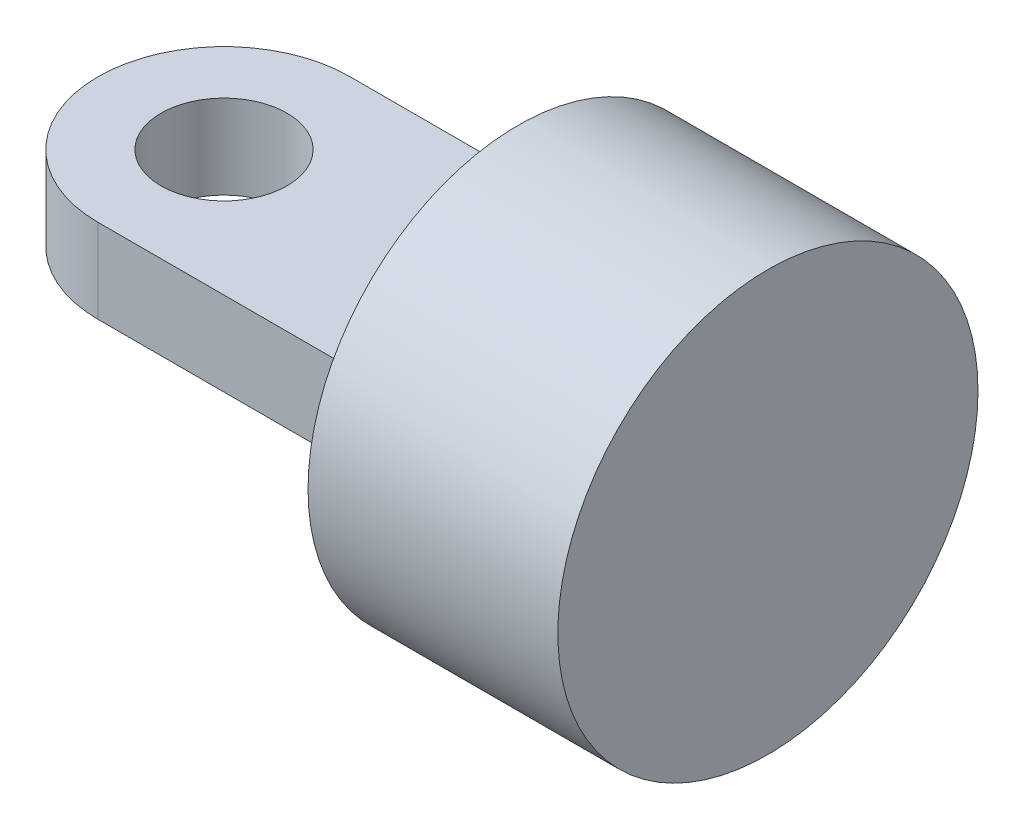
ISO-10303-21;
HEADER;
FILE_DESCRIPTION(('STEP AP214'),'2;1');
FILE_NAME('part.step','',(''),(''),'','','');
FILE_SCHEMA(('AUTOMOTIVE_DESIGN { 1 0 10303 214 1 1 1 1 }'));
ENDSEC;
DATA;
#1=APPLICATION_CONTEXT('core data for automotive mechanical design processes');
#2=APPLICATION_PROTOCOL_DEFINITION('international standard','automotive_design',2000,#1);
#3=PRODUCT_CONTEXT('',#1,'mechanical');
#4=PRODUCT('Part','Part','',(#3));
#5=PRODUCT_RELATED_PRODUCT_CATEGORY('part','',(#4));
#6=PRODUCT_DEFINITION_FORMATION('','',#4);
#7=PRODUCT_DEFINITION_CONTEXT('part definition',#1,'design');
#8=PRODUCT_DEFINITION('design','',#6,#7);
#9=PRODUCT_DEFINITION_SHAPE('','',#8);
#10=(LENGTH_UNIT() NAMED_UNIT(*) SI_UNIT(.MILLI.,.METRE.));
#11=(NAMED_UNIT(*) PLANE_ANGLE_UNIT() SI_UNIT($,.RADIAN.));
#12=(NAMED_UNIT(*) SI_UNIT($,.STERADIAN.) SOLID_ANGLE_UNIT());
#13=UNCERTAINTY_MEASURE_WITH_UNIT(LENGTH_MEASURE(1.E-05),#10,'distance_accuracy_value','');
#14=(GEOMETRIC_REPRESENTATION_CONTEXT(3) GLOBAL_UNCERTAINTY_ASSIGNED_CONTEXT((#13)) GLOBAL_UNIT_ASSIGNED_CONTEXT((#10,
#11,#12)) REPRESENTATION_CONTEXT('',''));
#15=CARTESIAN_POINT('',(0.,0.,0.));
#16=DIRECTION('',(0.,0.,1.));
#17=DIRECTION('',(1.,0.,0.));
#18=AXIS2_PLACEMENT_3D('',#15,#16,#17);
#19=CARTESIAN_POINT('',(-59.45,129.45,-53.2140969899561));
#20=DIRECTION('',(-1.,0.,0.));
#21=DIRECTION('',(0.,0.,1.));
#22=AXIS2_PLACEMENT_3D('',#19,#20,#21);
#23=PLANE('',#22);
#24=CARTESIAN_POINT('',(-59.45,0.,0.));
#25=DIRECTION('',(-1.,0.,0.));
#26=DIRECTION('',(0.,0.,1.));
#27=AXIS2_PLACEMENT_3D('',#24,#25,#26);
#28=CIRCLE('',#27,50.);
#29=CARTESIAN_POINT('',(-59.45,0.,50.));
#30=VERTEX_POINT('',#29);
#31=EDGE_CURVE('E37',#30,#30,#28,.F.);
#32=ORIENTED_EDGE('',*,*,#31,.F.);
#33=EDGE_LOOP('',(#32));
#34=FACE_BOUND('',#33,.T.);
#35=DIRECTION('',(0.,0.,-1.));
#36=VECTOR('',#35,1.);
#37=CARTESIAN_POINT('',(-59.45,-10.,-30.));
#38=LINE('',#37,#36);
#39=CARTESIAN_POINT('',(-59.45,-10.,30.));
#40=VERTEX_POINT('',#39);
#41=CARTESIAN_POINT('',(-59.45,-10.,-30.));
#42=VERTEX_POINT('',#41);
#43=EDGE_CURVE('E109',#40,#42,#38,.T.);
#44=ORIENTED_EDGE('',*,*,#43,.T.);
#45=DIRECTION('',(0.,1.,0.));
#46=VECTOR('',#45,1.);
#47=CARTESIAN_POINT('',(-59.45,-10.,-30.));
#48=LINE('',#47,#46);
#49=CARTESIAN_POINT('',(-59.45,10.,-30.));
#50=VERTEX_POINT('',#49);
#51=EDGE_CURVE('E114',#42,#50,#48,.T.);
#52=ORIENTED_EDGE('',*,*,#51,.T.);
#53=DIRECTION('',(0.,0.,-1.));
#54=VECTOR('',#53,1.);
#55=CARTESIAN_POINT('',(-59.45,10.,-30.));
#56=LINE('',#55,#54);
#57=CARTESIAN_POINT('',(-59.45,10.,30.));
#58=VERTEX_POINT('',#57);
#59=EDGE_CURVE('E89',#58,#50,#56,.T.);
#60=ORIENTED_EDGE('',*,*,#59,.F.);
#61=DIRECTION('',(0.,1.,0.));
#62=VECTOR('',#61,1.);
#63=CARTESIAN_POINT('',(-59.45,-10.,30.));
#64=LINE('',#63,#62);
#65=EDGE_CURVE('E81',#40,#58,#64,.T.);
#66=ORIENTED_EDGE('',*,*,#65,.F.);
#67=EDGE_LOOP('',(#44,#52,#60,#66));
#68=FACE_BOUND('',#67,.T.);
#69=ADVANCED_FACE('F33',(#34,#68),#23,.T.);
#70=CARTESIAN_POINT('',(-129.45,0.,0.));
#71=DIRECTION('',(1.,0.,0.));
#72=DIRECTION('',(0.,0.,-1.));
#73=AXIS2_PLACEMENT_3D('',#70,#71,#72);
#74=CYLINDRICAL_SURFACE('',#73,50.);
#75=CARTESIAN_POINT('',(0.,0.,0.));
#76=DIRECTION('',(1.,0.,0.));
#77=DIRECTION('',(0.,0.,-1.));
#78=AXIS2_PLACEMENT_3D('',#75,#76,#77);
#79=CIRCLE('',#78,50.);
#80=CARTESIAN_POINT('',(0.,0.,-50.));
#81=VERTEX_POINT('',#80);
#82=EDGE_CURVE('E11',#81,#81,#79,.T.);
#83=ORIENTED_EDGE('',*,*,#82,.F.);
#84=EDGE_LOOP('',(#83));
#85=FACE_BOUND('',#84,.T.);
#86=ORIENTED_EDGE('',*,*,#31,.T.);
#87=EDGE_LOOP('',(#86));
#88=FACE_BOUND('',#87,.T.);
#89=ADVANCED_FACE('F35',(#85,#88),#74,.T.);
#90=CARTESIAN_POINT('',(0.,0.,0.));
#91=DIRECTION('',(1.,0.,0.));
#92=DIRECTION('',(0.,0.,-1.));
#93=AXIS2_PLACEMENT_3D('',#90,#91,#92);
#94=PLANE('',#93);
#95=ORIENTED_EDGE('',*,*,#82,.T.);
#96=EDGE_LOOP('',(#95));
#97=FACE_BOUND('',#96,.T.);
#98=ADVANCED_FACE('F128',(#97),#94,.T.);
#99=CARTESIAN_POINT('',(-129.45,-10.,0.));
#100=DIRECTION('',(0.,1.,0.));
#101=DIRECTION('',(0.,0.,1.));
#102=AXIS2_PLACEMENT_3D('',#99,#100,#101);
#103=CYLINDRICAL_SURFACE('',#102,30.);
#104=DIRECTION('',(0.,1.,0.));
#105=VECTOR('',#104,1.);
#106=CARTESIAN_POINT('',(-129.45,-10.,30.));
#107=LINE('',#106,#105);
#108=CARTESIAN_POINT('',(-129.45,-10.,30.));
#109=VERTEX_POINT('',#108);
#110=CARTESIAN_POINT('',(-129.45,10.,30.));
#111=VERTEX_POINT('',#110);
#112=EDGE_CURVE('E72',#109,#111,#107,.T.);
#113=ORIENTED_EDGE('',*,*,#112,.T.);
#114=CARTESIAN_POINT('',(-129.45,10.,0.));
#115=DIRECTION('',(0.,1.,0.));
#116=DIRECTION('',(0.,0.,1.));
#117=AXIS2_PLACEMENT_3D('',#114,#115,#116);
#118=CIRCLE('',#117,30.);
#119=CARTESIAN_POINT('',(-129.45,10.,-30.));
#120=VERTEX_POINT('',#119);
#121=EDGE_CURVE('E76',#120,#111,#118,.T.);
#122=ORIENTED_EDGE('',*,*,#121,.F.);
#123=DIRECTION('',(0.,1.,0.));
#124=VECTOR('',#123,1.);
#125=CARTESIAN_POINT('',(-129.45,-10.,-30.));
#126=LINE('',#125,#124);
#127=CARTESIAN_POINT('',(-129.45,-10.,-30.));
#128=VERTEX_POINT('',#127);
#129=EDGE_CURVE('E56',#128,#120,#126,.T.);
#130=ORIENTED_EDGE('',*,*,#129,.F.);
#131=CARTESIAN_POINT('',(-129.45,-10.,0.));
#132=DIRECTION('',(0.,1.,0.));
#133=DIRECTION('',(0.,0.,1.));
#134=AXIS2_PLACEMENT_3D('',#131,#132,#133);
#135=CIRCLE('',#134,30.);
#136=EDGE_CURVE('E77',#128,#109,#135,.T.);
#137=ORIENTED_EDGE('',*,*,#136,.T.);
#138=EDGE_LOOP('',(#113,#122,#130,#137));
#139=FACE_BOUND('',#138,.T.);
#140=ADVANCED_FACE('F74',(#139),#103,.T.);
#141=CARTESIAN_POINT('',(-129.45,-10.,-30.));
#142=DIRECTION('',(0.,0.,-1.));
#143=DIRECTION('',(-1.,0.,0.));
#144=AXIS2_PLACEMENT_3D('',#141,#142,#143);
#145=PLANE('',#144);
#146=ORIENTED_EDGE('',*,*,#129,.T.);
#147=DIRECTION('',(-1.,0.,0.));
#148=VECTOR('',#147,1.);
#149=CARTESIAN_POINT('',(-129.45,10.,-30.));
#150=LINE('',#149,#148);
#151=EDGE_CURVE('E95',#50,#120,#150,.T.);
#152=ORIENTED_EDGE('',*,*,#151,.F.);
#153=ORIENTED_EDGE('',*,*,#51,.F.);
#154=DIRECTION('',(-1.,0.,0.));
#155=VECTOR('',#154,1.);
#156=CARTESIAN_POINT('',(-129.45,-10.,-30.));
#157=LINE('',#156,#155);
#158=EDGE_CURVE('E48',#42,#128,#157,.T.);
#159=ORIENTED_EDGE('',*,*,#158,.T.);
#160=EDGE_LOOP('',(#146,#152,#153,#159));
#161=FACE_BOUND('',#160,.T.);
#162=ADVANCED_FACE('F119',(#161),#145,.T.);
#163=CARTESIAN_POINT('',(-59.45,-10.,30.));
#164=DIRECTION('',(0.,0.,1.));
#165=DIRECTION('',(1.,0.,0.));
#166=AXIS2_PLACEMENT_3D('',#163,#164,#165);
#167=PLANE('',#166);
#168=ORIENTED_EDGE('',*,*,#65,.T.);
#169=DIRECTION('',(1.,0.,0.));
#170=VECTOR('',#169,1.);
#171=CARTESIAN_POINT('',(-59.45,10.,30.));
#172=LINE('',#171,#170);
#173=EDGE_CURVE('E84',#111,#58,#172,.T.);
#174=ORIENTED_EDGE('',*,*,#173,.F.);
#175=ORIENTED_EDGE('',*,*,#112,.F.);
#176=DIRECTION('',(1.,0.,0.));
#177=VECTOR('',#176,1.);
#178=CARTESIAN_POINT('',(-59.45,-10.,30.));
#179=LINE('',#178,#177);
#180=EDGE_CURVE('E107',#109,#40,#179,.T.);
#181=ORIENTED_EDGE('',*,*,#180,.T.);
#182=EDGE_LOOP('',(#168,#174,#175,#181));
#183=FACE_BOUND('',#182,.T.);
#184=ADVANCED_FACE('F85',(#183),#167,.T.);
#185=CARTESIAN_POINT('',(-129.45,-10.,0.));
#186=DIRECTION('',(0.,1.,0.));
#187=DIRECTION('',(0.,0.,1.));
#188=AXIS2_PLACEMENT_3D('',#185,#186,#187);
#189=PLANE('',#188);
#190=CARTESIAN_POINT('',(-129.45,-10.,0.));
#191=DIRECTION('',(0.,1.,0.));
#192=DIRECTION('',(0.,0.,1.));
#193=AXIS2_PLACEMENT_3D('',#190,#191,#192);
#194=CIRCLE('',#193,15.);
#195=CARTESIAN_POINT('',(-129.45,-10.,15.));
#196=VERTEX_POINT('',#195);
#197=EDGE_CURVE('E103',#196,#196,#194,.T.);
#198=ORIENTED_EDGE('',*,*,#197,.T.);
#199=EDGE_LOOP('',(#198));
#200=FACE_BOUND('',#199,.T.);
#201=ORIENTED_EDGE('',*,*,#136,.F.);
#202=ORIENTED_EDGE('',*,*,#158,.F.);
#203=ORIENTED_EDGE('',*,*,#43,.F.);
#204=ORIENTED_EDGE('',*,*,#180,.F.);
#205=EDGE_LOOP('',(#201,#202,#203,#204));
#206=FACE_BOUND('',#205,.T.);
#207=ADVANCED_FACE('F126',(#200,#206),#189,.F.);
#208=CARTESIAN_POINT('',(-129.45,-10.,0.));
#209=DIRECTION('',(0.,1.,0.));
#210=DIRECTION('',(0.,0.,1.));
#211=AXIS2_PLACEMENT_3D('',#208,#209,#210);
#212=CYLINDRICAL_SURFACE('',#211,15.);
#213=ORIENTED_EDGE('',*,*,#197,.F.);
#214=EDGE_LOOP('',(#213));
#215=FACE_BOUND('',#214,.T.);
#216=CARTESIAN_POINT('',(-129.45,10.,0.));
#217=DIRECTION('',(0.,1.,0.));
#218=DIRECTION('',(0.,0.,1.));
#219=AXIS2_PLACEMENT_3D('',#216,#217,#218);
#220=CIRCLE('',#219,15.);
#221=CARTESIAN_POINT('',(-129.45,10.,15.));
#222=VERTEX_POINT('',#221);
#223=EDGE_CURVE('E96',#222,#222,#220,.T.);
#224=ORIENTED_EDGE('',*,*,#223,.T.);
#225=EDGE_LOOP('',(#224));
#226=FACE_BOUND('',#225,.T.);
#227=ADVANCED_FACE('F173',(#215,#226),#212,.F.);
#228=CARTESIAN_POINT('',(-129.45,10.,0.));
#229=DIRECTION('',(0.,1.,0.));
#230=DIRECTION('',(0.,0.,1.));
#231=AXIS2_PLACEMENT_3D('',#228,#229,#230);
#232=PLANE('',#231);
#233=ORIENTED_EDGE('',*,*,#121,.T.);
#234=ORIENTED_EDGE('',*,*,#173,.T.);
#235=ORIENTED_EDGE('',*,*,#59,.T.);
#236=ORIENTED_EDGE('',*,*,#151,.T.);
#237=EDGE_LOOP('',(#233,#234,#235,#236));
#238=FACE_BOUND('',#237,.T.);
#239=ORIENTED_EDGE('',*,*,#223,.F.);
#240=EDGE_LOOP('',(#239));
#241=FACE_BOUND('',#240,.T.);
#242=ADVANCED_FACE('F92',(#238,#241),#232,.T.);
#243=CLOSED_SHELL('',(#69,#89,#98,#140,#162,#184,#207,#227,#242));
#244=MANIFOLD_SOLID_BREP('B2',#243);
#245=ADVANCED_BREP_SHAPE_REPRESENTATION('',(#18,#244),#14);
#246=SHAPE_DEFINITION_REPRESENTATION(#9,#245);
ENDSEC;
END-ISO-10303-21;
